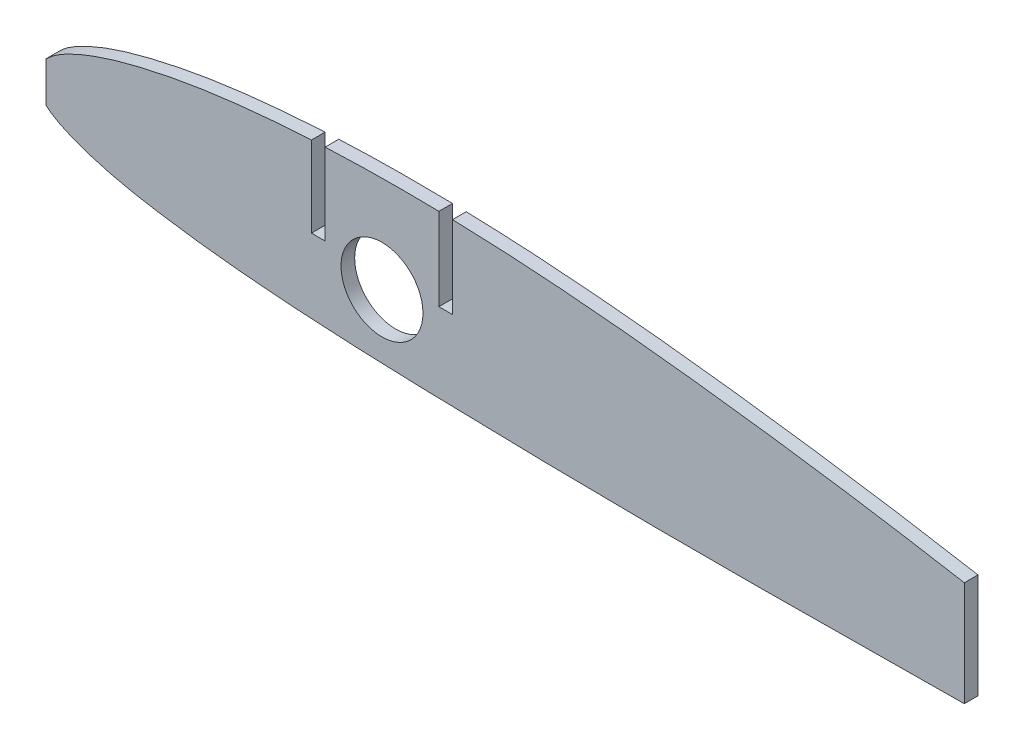
ISO-10303-21;
HEADER;
FILE_DESCRIPTION(('STEP AP214'),'2;1');
FILE_NAME('part.step','',(''),(''),'','','');
FILE_SCHEMA(('AUTOMOTIVE_DESIGN { 1 0 10303 214 1 1 1 1 }'));
ENDSEC;
DATA;
#1=APPLICATION_CONTEXT('core data for automotive mechanical design processes');
#2=APPLICATION_PROTOCOL_DEFINITION('international standard','automotive_design',2000,#1);
#3=PRODUCT_CONTEXT('',#1,'mechanical');
#4=PRODUCT('Part','Part','',(#3));
#5=PRODUCT_RELATED_PRODUCT_CATEGORY('part','',(#4));
#6=PRODUCT_DEFINITION_FORMATION('','',#4);
#7=PRODUCT_DEFINITION_CONTEXT('part definition',#1,'design');
#8=PRODUCT_DEFINITION('design','',#6,#7);
#9=PRODUCT_DEFINITION_SHAPE('','',#8);
#10=(LENGTH_UNIT() NAMED_UNIT(*) SI_UNIT(.MILLI.,.METRE.));
#11=(NAMED_UNIT(*) PLANE_ANGLE_UNIT() SI_UNIT($,.RADIAN.));
#12=(NAMED_UNIT(*) SI_UNIT($,.STERADIAN.) SOLID_ANGLE_UNIT());
#13=UNCERTAINTY_MEASURE_WITH_UNIT(LENGTH_MEASURE(1.E-05),#10,'distance_accuracy_value','');
#14=(GEOMETRIC_REPRESENTATION_CONTEXT(3) GLOBAL_UNCERTAINTY_ASSIGNED_CONTEXT((#13)) GLOBAL_UNIT_ASSIGNED_CONTEXT((#10,
#11,#12)) REPRESENTATION_CONTEXT('',''));
#15=CARTESIAN_POINT('',(0.,0.,0.));
#16=DIRECTION('',(0.,0.,1.));
#17=DIRECTION('',(1.,0.,0.));
#18=AXIS2_PLACEMENT_3D('',#15,#16,#17);
#19=CARTESIAN_POINT('',(276.744987748225,-2.79197214936151,353.5));
#20=CARTESIAN_POINT('',(265.385702299539,-0.102525952060226,353.5));
#21=CARTESIAN_POINT('',(253.985388892226,2.40722052673429,353.5));
#22=CARTESIAN_POINT('',(231.123115134351,7.13717976869783,353.5));
#23=CARTESIAN_POINT('',(219.668942239519,9.35664169025446,353.5));
#24=CARTESIAN_POINT('',(202.450532833243,12.4496078313555,353.5));
#25=CARTESIAN_POINT('',(196.704666185283,13.440005466849,353.5));
#26=CARTESIAN_POINT('',(185.197495983674,15.3228461116195,353.5));
#27=CARTESIAN_POINT('',(179.436018193987,16.2141835090313,353.5));
#28=CARTESIAN_POINT('',(167.896810084417,17.893728145991,353.5));
#29=CARTESIAN_POINT('',(162.119320772121,18.6834646951421,353.5));
#30=CARTESIAN_POINT('',(150.549559093403,20.1691321713492,353.5));
#31=CARTESIAN_POINT('',(144.75767697228,20.8675393934082,353.5));
#32=CARTESIAN_POINT('',(133.154760401473,22.1428230577545,353.5));
#33=CARTESIAN_POINT('',(127.340720116597,22.7192762264088,353.5));
#34=CARTESIAN_POINT('',(115.726117513162,23.709424357867,353.5));
#35=CARTESIAN_POINT('',(109.921864101747,24.1232862944582,353.5));
#36=CARTESIAN_POINT('',(92.520744809096,25.0546950445763,353.5));
#37=CARTESIAN_POINT('',(80.9357651419829,25.2555294240696,353.5));
#38=CARTESIAN_POINT('',(63.5895796794595,24.7232065880675,353.5));
#39=CARTESIAN_POINT('',(57.8126964717804,24.4077796395751,353.5));
#40=CARTESIAN_POINT('',(49.1574110404706,23.6671363341342,353.5));
#41=CARTESIAN_POINT('',(46.2739625797033,23.3763787737244,353.5));
#42=CARTESIAN_POINT('',(40.5111502612539,22.6860279402097,353.5));
#43=CARTESIAN_POINT('',(37.6318485685876,22.2847782579894,353.5));
#44=CARTESIAN_POINT('',(31.8789183292975,21.3311158846026,353.5));
#45=CARTESIAN_POINT('',(29.0054092128865,20.7755209326261,353.5));
#46=CARTESIAN_POINT('',(24.6999044452779,19.8153257223513,353.5));
#47=CARTESIAN_POINT('',(23.2654573893097,19.4760440224903,353.5));
#48=CARTESIAN_POINT('',(20.3984150938273,18.7481383098557,353.5));
#49=CARTESIAN_POINT('',(18.9637408163139,18.3570021632943,353.5));
#50=CARTESIAN_POINT('',(16.1067481624841,17.4970007643702,353.5));
#51=CARTESIAN_POINT('',(14.6927100813507,17.0309960304498,353.5));
#52=CARTESIAN_POINT('',(11.9024860352476,16.0047269328264,353.5));
#53=CARTESIAN_POINT('',(10.5261898907188,15.4447369391054,353.5));
#54=CARTESIAN_POINT('',(8.5001267402739,14.5091751229376,353.5));
#55=CARTESIAN_POINT('',(7.83036180247167,14.1834023037448,353.5));
#56=CARTESIAN_POINT('',(6.5125638980945,13.4777395440471,353.5));
#57=CARTESIAN_POINT('',(5.8652484111271,13.093583044232,353.5));
#58=CARTESIAN_POINT('',(4.63339278490183,12.255605476166,353.5));
#59=CARTESIAN_POINT('',(4.04506664060774,11.801499913743,353.5));
#60=CARTESIAN_POINT('',(3.20911851171096,11.0611287352593,353.5));
#61=CARTESIAN_POINT('',(2.9384315833436,10.8042079578778,353.5));
#62=CARTESIAN_POINT('',(2.41656280801707,10.2655506709287,353.5));
#63=CARTESIAN_POINT('',(2.16520777163042,9.98350791441402,353.5));
#64=CARTESIAN_POINT('',(1.6961027069432,9.39722001277652,353.5));
#65=CARTESIAN_POINT('',(1.47744299371281,9.09171798017102,353.5));
#66=CARTESIAN_POINT('',(1.08543951514707,8.44707856078649,353.5));
#67=CARTESIAN_POINT('',(0.915512906059717,8.1138974038108,353.5));
#68=CARTESIAN_POINT('',(0.714798113541436,7.591559329555,353.5));
#69=CARTESIAN_POINT('',(0.657190765905255,7.41357378269642,353.5));
#70=CARTESIAN_POINT('',(0.566275814158105,7.04748076892279,353.5));
#71=CARTESIAN_POINT('',(0.533643429127128,6.85952694162572,353.5));
#72=CARTESIAN_POINT('',(0.498702002917335,6.48582378560063,353.5));
#73=CARTESIAN_POINT('',(0.495732966569499,6.29850011372436,353.5));
#74=CARTESIAN_POINT('',(0.52230968996706,5.92279426922192,353.5));
#75=CARTESIAN_POINT('',(0.553180601421499,5.73365744403695,353.5));
#76=CARTESIAN_POINT('',(0.641956645984156,5.36725473118463,353.5));
#77=CARTESIAN_POINT('',(0.699629973355688,5.18817461227293,353.5));
#78=CARTESIAN_POINT('',(0.835770495049769,4.83646484464701,353.5));
#79=CARTESIAN_POINT('',(0.914681224373518,4.66311478504048,353.5));
#80=CARTESIAN_POINT('',(1.17380292249289,4.16051764174336,353.5));
#81=CARTESIAN_POINT('',(1.37643115136686,3.84582434066885,353.5));
#82=CARTESIAN_POINT('',(1.82283565835699,3.24449107918009,353.5));
#83=CARTESIAN_POINT('',(2.06824589304086,2.95671921686081,353.5));
#84=CARTESIAN_POINT('',(2.58534964053072,2.41051262223144,353.5));
#85=CARTESIAN_POINT('',(2.85620580773243,2.15293436619,353.5));
#86=CARTESIAN_POINT('',(3.69926945542783,1.41867709401816,353.5));
#87=CARTESIAN_POINT('',(4.30292332269781,0.981675809429943,353.5));
#88=CARTESIAN_POINT('',(5.26264941910545,0.394618320622371,353.5));
#89=CARTESIAN_POINT('',(5.59164837499301,0.21018795952157,353.5));
#90=CARTESIAN_POINT('',(6.25469678184452,-0.135942128867334,353.5));
#91=CARTESIAN_POINT('',(6.5899315213033,-0.298692503036244,353.5));
#92=CARTESIAN_POINT('',(7.60252113336086,-0.767803381874437,353.5));
#93=CARTESIAN_POINT('',(8.2859382103845,-1.0573119714262,353.5));
#94=CARTESIAN_POINT('',(9.66288549070147,-1.60821634971927,353.5));
#95=CARTESIAN_POINT('',(10.3572266890316,-1.86735770780067,353.5));
#96=CARTESIAN_POINT('',(12.4550745137421,-2.60357290101599,353.5));
#97=CARTESIAN_POINT('',(13.8732505211657,-3.03986830856125,353.5));
#98=CARTESIAN_POINT('',(16.7391974161066,-3.83019030322058,353.5));
#99=CARTESIAN_POINT('',(18.1889738248611,-4.18425414277734,353.5));
#100=CARTESIAN_POINT('',(22.5423729703754,-5.14396280214318,353.5));
#101=CARTESIAN_POINT('',(25.4593395833233,-5.65526132904842,353.5));
#102=CARTESIAN_POINT('',(31.3062708137163,-6.56423395168542,353.5));
#103=CARTESIAN_POINT('',(34.2357016185216,-6.96657446813973,353.5));
#104=CARTESIAN_POINT('',(40.1041654270331,-7.68731612494017,353.5));
#105=CARTESIAN_POINT('',(43.0433869770674,-8.00406905310895,353.5));
#106=CARTESIAN_POINT('',(51.8740867408924,-8.84037900937318,353.5));
#107=CARTESIAN_POINT('',(57.7783660734944,-9.24803271848889,353.5));
#108=CARTESIAN_POINT('',(66.6480467800239,-9.74358364190067,353.5));
#109=CARTESIAN_POINT('',(69.6075618701688,-9.88782359391551,353.5));
#110=CARTESIAN_POINT('',(75.5255855472627,-10.1412458429705,353.5));
#111=CARTESIAN_POINT('',(78.4846108166473,-10.250077692201,353.5));
#112=CARTESIAN_POINT('',(84.4026798275555,-10.4431510814279,353.5));
#113=CARTESIAN_POINT('',(87.3617234167665,-10.5275953814749,353.5));
#114=CARTESIAN_POINT('',(93.279819329357,-10.6848569624802,353.5));
#115=CARTESIAN_POINT('',(96.238871495544,-10.7578835000571,353.5));
#116=CARTESIAN_POINT('',(111.034153793677,-11.0944388233902,353.5));
#117=CARTESIAN_POINT('',(122.870449547974,-11.2706104317724,353.5));
#118=CARTESIAN_POINT('',(140.62500502378,-11.3859794315242,353.5));
#119=CARTESIAN_POINT('',(146.543208340051,-11.4002640818137,353.5));
#120=CARTESIAN_POINT('',(158.379650660843,-11.3813247990991,353.5));
#121=CARTESIAN_POINT('',(164.297889135731,-11.3488059215455,353.5));
#122=CARTESIAN_POINT('',(176.134384089483,-11.2598010780386,353.5));
#123=CARTESIAN_POINT('',(182.052639741575,-11.2044157213199,353.5));
#124=CARTESIAN_POINT('',(193.889154400691,-11.0891788869695,353.5));
#125=CARTESIAN_POINT('',(199.807414258045,-11.0281954396602,353.5));
#126=CARTESIAN_POINT('',(217.562198327746,-10.8392577945027,353.5));
#127=CARTESIAN_POINT('',(229.398721047248,-10.7132908878643,353.5));
#128=CARTESIAN_POINT('',(253.071828300073,-10.3790698524525,353.5));
#129=CARTESIAN_POINT('',(264.908412972978,-10.1640212774946,353.5));
#130=CARTESIAN_POINT('',(276.744987748225,-9.97546724161573,353.5));
#131=B_SPLINE_CURVE_WITH_KNOTS('',3,(#19,#20,#21,#22,#23,#24,#25,#26,#27,#28,#29,#30,#31,#32,
#33,#34,#35,#36,#37,#38,#39,#40,#41,#42,#43,#44,#45,#46,#47,#48,#49,#50,#51,#52,#53,#54,#55,#56,
#57,#58,#59,#60,#61,#62,#63,#64,#65,#66,#67,#68,#69,#70,#71,#72,#73,#74,#75,#76,#77,#78,#79,#80,
#81,#82,#83,#84,#85,#86,#87,#88,#89,#90,#91,#92,#93,#94,#95,#96,#97,#98,#99,#100,#101,#102,#103,
#104,#105,#106,#107,#108,#109,#110,#111,#112,#113,#114,#115,#116,#117,#118,#119,#120,#121,#122,
#123,#124,#125,#126,#127,#128,#129,#130),.UNSPECIFIED.,.F.,.F.,(4,2,2,2,2,2,2,2,2,2,2,2,2,2,2,2,
2,2,2,2,2,2,2,2,2,2,2,2,2,2,2,2,2,2,2,2,2,2,2,2,2,2,2,2,2,2,2,2,2,2,2,2,2,2,2,4),(0.,
0.0625000000000003,0.125000000000001,0.156250000000001,0.187500000000001,0.218750000000001,
0.250000000000001,0.281250000000001,0.312500000000001,0.375000000000001,0.406250000000001,
0.421875000000001,0.437500000000001,0.453125000000001,0.460937500000001,0.468750000000001,
0.476562500000001,0.484375000000001,0.488281250000001,0.492187500000001,0.496093750000001,
0.498046875000001,0.500000000000001,0.501953125000001,0.503906250000001,0.504882812500001,
0.505859375000001,0.506835937500001,0.507812500000001,0.508789062500001,0.509765625000001,
0.511718750000001,0.513671875000001,0.515625000000001,0.519531250000001,0.521484375000001,
0.523437500000001,0.527343750000001,0.531250000000001,0.539062500000001,0.546875000000001,
0.562500000000001,0.578125000000001,0.593750000000001,0.625000000000001,0.640625000000001,
0.656250000000001,0.671875000000001,0.687500000000001,0.750000000000001,0.781250000000001,
0.812500000000001,0.843750000000001,0.875000000000001,0.937500000000001,1.),.UNSPECIFIED.);
#132=DIRECTION('',(0.,0.,-1.));
#133=VECTOR('',#132,1.);
#134=SURFACE_OF_LINEAR_EXTRUSION('',#131,#133);
#135=CARTESIAN_POINT('',(61.3107439726029,24.5596377584493,350.5));
#136=CARTESIAN_POINT('',(58.219569717087,24.3913710300533,350.5));
#137=CARTESIAN_POINT('',(55.1300797862992,24.1782248657974,350.5));
#138=CARTESIAN_POINT('',(49.1574110404706,23.6671363341342,350.5));
#139=CARTESIAN_POINT('',(46.2739625797033,23.3763787737244,350.5));
#140=CARTESIAN_POINT('',(40.5111502612539,22.6860279402097,350.5));
#141=CARTESIAN_POINT('',(37.6318485685876,22.2847782579894,350.5));
#142=CARTESIAN_POINT('',(31.8789183292975,21.3311158846026,350.5));
#143=CARTESIAN_POINT('',(29.0054092128865,20.7755209326261,350.5));
#144=CARTESIAN_POINT('',(24.6999044452779,19.8153257223513,350.5));
#145=CARTESIAN_POINT('',(23.2654573893097,19.4760440224903,350.5));
#146=CARTESIAN_POINT('',(20.3984150938273,18.7481383098557,350.5));
#147=CARTESIAN_POINT('',(18.9637408163139,18.3570021632943,350.5));
#148=CARTESIAN_POINT('',(16.1067481624841,17.4970007643702,350.5));
#149=CARTESIAN_POINT('',(14.6927100813507,17.0309960304498,350.5));
#150=CARTESIAN_POINT('',(11.9024860352476,16.0047269328264,350.5));
#151=CARTESIAN_POINT('',(10.5261898907188,15.4447369391054,350.5));
#152=CARTESIAN_POINT('',(8.5001267402739,14.5091751229376,350.5));
#153=CARTESIAN_POINT('',(7.83036180247167,14.1834023037448,350.5));
#154=CARTESIAN_POINT('',(6.5125638980945,13.4777395440471,350.5));
#155=CARTESIAN_POINT('',(5.8652484111271,13.093583044232,350.5));
#156=CARTESIAN_POINT('',(4.63339278490183,12.255605476166,350.5));
#157=CARTESIAN_POINT('',(4.04506664060774,11.801499913743,350.5));
#158=CARTESIAN_POINT('',(3.32225590441982,11.161330723726,350.5));
#159=CARTESIAN_POINT('',(3.15955316405278,11.0111682031635,350.5));
#160=CARTESIAN_POINT('',(3.00003480368661,10.8569542910879,350.5));
#161=B_SPLINE_CURVE_WITH_KNOTS('',3,(#135,#136,#137,#138,#139,#140,#141,#142,#143,#144,#145,
#146,#147,#148,#149,#150,#151,#152,#153,#154,#155,#156,#157,#158,#159,#160),.UNSPECIFIED.,.F.,
.F.,(4,2,2,2,2,2,2,2,2,2,2,2,4),(0.38952842406295,0.406250000000001,0.421875000000001,
0.437500000000001,0.453125000000001,0.460937500000001,0.468750000000001,0.476562500000001,
0.484375000000001,0.488281250000001,0.492187500000001,0.496093750000001,0.497253865975292),.UNSPECIFIED.);
#162=CARTESIAN_POINT('',(61.3107511672693,24.5594393155338,350.5));
#163=VERTEX_POINT('',#162);
#164=CARTESIAN_POINT('',(3.00000000427704,10.8569903087676,350.5));
#165=VERTEX_POINT('',#164);
#166=EDGE_CURVE('E160',#163,#165,#161,.T.);
#167=ORIENTED_EDGE('',*,*,#166,.T.);
#168=DIRECTION('',(0.,0.,-1.));
#169=VECTOR('',#168,1.);
#170=CARTESIAN_POINT('',(2.99999999999999,10.8569206446117,353.5));
#171=LINE('',#170,#169);
#172=CARTESIAN_POINT('',(3.,10.8569991547267,353.5));
#173=VERTEX_POINT('',#172);
#174=EDGE_CURVE('E58',#165,#173,#171,.F.);
#175=ORIENTED_EDGE('',*,*,#174,.T.);
#176=CARTESIAN_POINT('',(3.00003924309868,10.8569585828748,353.5));
#177=CARTESIAN_POINT('',(3.1595561827416,11.0111709891881,353.5));
#178=CARTESIAN_POINT('',(3.32225743982461,11.1613320835824,353.5));
#179=CARTESIAN_POINT('',(4.04506664060774,11.801499913743,353.5));
#180=CARTESIAN_POINT('',(4.63339278490183,12.255605476166,353.5));
#181=CARTESIAN_POINT('',(5.8652484111271,13.093583044232,353.5));
#182=CARTESIAN_POINT('',(6.5125638980945,13.4777395440471,353.5));
#183=CARTESIAN_POINT('',(7.83036180247167,14.1834023037448,353.5));
#184=CARTESIAN_POINT('',(8.5001267402739,14.5091751229376,353.5));
#185=CARTESIAN_POINT('',(10.5261898907188,15.4447369391054,353.5));
#186=CARTESIAN_POINT('',(11.9024860352476,16.0047269328264,353.5));
#187=CARTESIAN_POINT('',(14.6927100813507,17.0309960304498,353.5));
#188=CARTESIAN_POINT('',(16.1067481624841,17.4970007643702,353.5));
#189=CARTESIAN_POINT('',(18.9637408163139,18.3570021632943,353.5));
#190=CARTESIAN_POINT('',(20.3984150938273,18.7481383098557,353.5));
#191=CARTESIAN_POINT('',(23.2654573893097,19.4760440224903,353.5));
#192=CARTESIAN_POINT('',(24.6999044452779,19.8153257223513,353.5));
#193=CARTESIAN_POINT('',(29.0054092128865,20.7755209326261,353.5));
#194=CARTESIAN_POINT('',(31.8789183292975,21.3311158846026,353.5));
#195=CARTESIAN_POINT('',(37.6318485685876,22.2847782579894,353.5));
#196=CARTESIAN_POINT('',(40.5111502612539,22.6860279402097,353.5));
#197=CARTESIAN_POINT('',(46.2739625797033,23.3763787737244,353.5));
#198=CARTESIAN_POINT('',(49.1574110404706,23.6671363341342,353.5));
#199=CARTESIAN_POINT('',(55.1300797935678,24.1782248664194,353.5));
#200=CARTESIAN_POINT('',(58.2195697316331,24.3913710310568,353.5));
#201=CARTESIAN_POINT('',(61.3107439944338,24.5596377596377,353.5));
#202=B_SPLINE_CURVE_WITH_KNOTS('',3,(#176,#177,#178,#179,#180,#181,#182,#183,#184,#185,#186,
#187,#188,#189,#190,#191,#192,#193,#194,#195,#196,#197,#198,#199,#200,#201),.UNSPECIFIED.,.F.,
.F.,(4,2,2,2,2,2,2,2,2,2,2,2,4),(0.389528424023585,0.39068852923683,0.39459477923683,
0.39850102923683,0.40240727923683,0.41021977923683,0.41803227923683,0.42584477923683,
0.43365727923683,0.44928227923683,0.46490727923683,0.48053227923683,0.497253855213246),.UNSPECIFIED.);
#203=CARTESIAN_POINT('',(61.3107511663373,24.559505966989,353.5));
#204=VERTEX_POINT('',#203);
#205=EDGE_CURVE('E145',#204,#173,#202,.F.);
#206=ORIENTED_EDGE('',*,*,#205,.F.);
#207=DIRECTION('',(0.,0.,-1.));
#208=VECTOR('',#207,1.);
#209=CARTESIAN_POINT('',(61.3107511663373,24.559638150037,353.5));
#210=LINE('',#209,#208);
#211=EDGE_CURVE('E171',#204,#163,#210,.T.);
#212=ORIENTED_EDGE('',*,*,#211,.T.);
#213=EDGE_LOOP('',(#167,#175,#206,#212));
#214=FACE_BOUND('',#213,.T.);
#215=ADVANCED_FACE('F39',(#214),#134,.F.);
#216=CARTESIAN_POINT('',(204.744987739681,-10.9756337233499,353.5));
#217=CARTESIAN_POINT('',(199.153622505491,-11.0349220310696,353.5));
#218=CARTESIAN_POINT('',(193.562258660181,-11.0923614480006,353.5));
#219=CARTESIAN_POINT('',(182.052639741575,-11.2044157213199,353.5));
#220=CARTESIAN_POINT('',(176.134384089483,-11.2598010780386,353.5));
#221=CARTESIAN_POINT('',(164.297889135731,-11.3488059215455,353.5));
#222=CARTESIAN_POINT('',(158.379650660843,-11.3813247990991,353.5));
#223=CARTESIAN_POINT('',(146.543208340051,-11.4002640818137,353.5));
#224=CARTESIAN_POINT('',(140.62500502378,-11.3859794315242,353.5));
#225=CARTESIAN_POINT('',(122.870449547974,-11.2706104317724,353.5));
#226=CARTESIAN_POINT('',(111.034153793677,-11.0944388233902,353.5));
#227=CARTESIAN_POINT('',(96.238871495544,-10.7578835000571,353.5));
#228=CARTESIAN_POINT('',(93.279819329357,-10.6848569624802,353.5));
#229=CARTESIAN_POINT('',(87.3617234167665,-10.5275953814749,353.5));
#230=CARTESIAN_POINT('',(84.4026798275555,-10.4431510814279,353.5));
#231=CARTESIAN_POINT('',(78.4846108166473,-10.250077692201,353.5));
#232=CARTESIAN_POINT('',(75.5255855472627,-10.1412458429705,353.5));
#233=CARTESIAN_POINT('',(69.6075618701688,-9.88782359391551,353.5));
#234=CARTESIAN_POINT('',(66.6480467800239,-9.74358364190067,353.5));
#235=CARTESIAN_POINT('',(57.7783660734944,-9.24803271848889,353.5));
#236=CARTESIAN_POINT('',(51.8740867408924,-8.84037900937318,353.5));
#237=CARTESIAN_POINT('',(43.0433869770674,-8.00406905310895,353.5));
#238=CARTESIAN_POINT('',(40.1041654270331,-7.68731612494017,353.5));
#239=CARTESIAN_POINT('',(34.2357016185216,-6.96657446813973,353.5));
#240=CARTESIAN_POINT('',(31.3062708137163,-6.56423395168542,353.5));
#241=CARTESIAN_POINT('',(25.4593395833233,-5.65526132904842,353.5));
#242=CARTESIAN_POINT('',(22.5423729703754,-5.14396280214318,353.5));
#243=CARTESIAN_POINT('',(18.1889738248611,-4.18425414277734,353.5));
#244=CARTESIAN_POINT('',(16.7391974161066,-3.83019030322058,353.5));
#245=CARTESIAN_POINT('',(13.8732505211657,-3.03986830856125,353.5));
#246=CARTESIAN_POINT('',(12.4550745137421,-2.60357290101599,353.5));
#247=CARTESIAN_POINT('',(10.3572266890316,-1.86735770780067,353.5));
#248=CARTESIAN_POINT('',(9.66288549070147,-1.60821634971927,353.5));
#249=CARTESIAN_POINT('',(8.2859382103845,-1.0573119714262,353.5));
#250=CARTESIAN_POINT('',(7.60252113336086,-0.767803381874437,353.5));
#251=CARTESIAN_POINT('',(6.5899315213033,-0.298692503036244,353.5));
#252=CARTESIAN_POINT('',(6.25469678184452,-0.135942128867334,353.5));
#253=CARTESIAN_POINT('',(5.59164837499301,0.21018795952157,353.5));
#254=CARTESIAN_POINT('',(5.26264941910545,0.394618320622371,353.5));
#255=CARTESIAN_POINT('',(4.30292332269781,0.981675809429943,353.5));
#256=CARTESIAN_POINT('',(3.69926945542783,1.41867709401816,353.5));
#257=CARTESIAN_POINT('',(3.09121143579209,1.94825872648496,353.5));
#258=CARTESIAN_POINT('',(3.04546839482108,1.98867939904061,353.5));
#259=CARTESIAN_POINT('',(3.00000729271764,2.02945581023101,353.5));
#260=B_SPLINE_CURVE_WITH_KNOTS('',3,(#216,#217,#218,#219,#220,#221,#222,#223,#224,#225,#226,
#227,#228,#229,#230,#231,#232,#233,#234,#235,#236,#237,#238,#239,#240,#241,#242,#243,#244,#245,
#246,#247,#248,#249,#250,#251,#252,#253,#254,#255,#256,#257,#258,#259),.UNSPECIFIED.,.F.,.F.,(4,
2,2,2,2,2,2,2,2,2,2,2,2,2,2,2,2,2,2,2,2,4),(0.51530518715345,0.544829089195542,
0.576079089195541,0.607329089195541,0.638579089195541,0.701079089195541,0.716704089195541,
0.732329089195541,0.747954089195541,0.763579089195541,0.794829089195541,0.810454089195541,
0.826079089195541,0.841704089195541,0.849516589195541,0.857329089195541,0.861235339195541,
0.865141589195541,0.867094714195541,0.869047839195541,0.872954089195541,0.873273902042092),.UNSPECIFIED.);
#261=CARTESIAN_POINT('',(3.,2.02944768401191,353.5));
#262=VERTEX_POINT('',#261);
#263=CARTESIAN_POINT('',(204.744987748225,-10.9756337232593,353.5));
#264=VERTEX_POINT('',#263);
#265=EDGE_CURVE('E141',#262,#264,#260,.F.);
#266=ORIENTED_EDGE('',*,*,#265,.F.);
#267=DIRECTION('',(0.,0.,-1.));
#268=VECTOR('',#267,1.);
#269=CARTESIAN_POINT('',(2.99999999999996,2.02946235145148,353.5));
#270=LINE('',#269,#268);
#271=CARTESIAN_POINT('',(3.,2.02943946918539,350.5));
#272=VERTEX_POINT('',#271);
#273=EDGE_CURVE('E132',#262,#272,#270,.T.);
#274=ORIENTED_EDGE('',*,*,#273,.T.);
#275=CARTESIAN_POINT('',(3.00001137381415,2.02945214968633,350.5));
#276=CARTESIAN_POINT('',(3.04547113242514,1.98867697996722,350.5));
#277=CARTESIAN_POINT('',(3.09121281274962,1.94825752723852,350.5));
#278=CARTESIAN_POINT('',(3.69926945542783,1.41867709401816,350.5));
#279=CARTESIAN_POINT('',(4.30292332269781,0.981675809429943,350.5));
#280=CARTESIAN_POINT('',(5.26264941910545,0.394618320622371,350.5));
#281=CARTESIAN_POINT('',(5.59164837499301,0.21018795952157,350.5));
#282=CARTESIAN_POINT('',(6.25469678184452,-0.135942128867334,350.5));
#283=CARTESIAN_POINT('',(6.5899315213033,-0.298692503036244,350.5));
#284=CARTESIAN_POINT('',(7.60252113336086,-0.767803381874437,350.5));
#285=CARTESIAN_POINT('',(8.2859382103845,-1.0573119714262,350.5));
#286=CARTESIAN_POINT('',(9.66288549070147,-1.60821634971927,350.5));
#287=CARTESIAN_POINT('',(10.3572266890316,-1.86735770780067,350.5));
#288=CARTESIAN_POINT('',(12.4550745137421,-2.60357290101599,350.5));
#289=CARTESIAN_POINT('',(13.8732505211657,-3.03986830856125,350.5));
#290=CARTESIAN_POINT('',(16.7391974161066,-3.83019030322058,350.5));
#291=CARTESIAN_POINT('',(18.1889738248611,-4.18425414277734,350.5));
#292=CARTESIAN_POINT('',(22.5423729703754,-5.14396280214318,350.5));
#293=CARTESIAN_POINT('',(25.4593395833233,-5.65526132904842,350.5));
#294=CARTESIAN_POINT('',(31.3062708137163,-6.56423395168542,350.5));
#295=CARTESIAN_POINT('',(34.2357016185216,-6.96657446813973,350.5));
#296=CARTESIAN_POINT('',(40.1041654270331,-7.68731612494017,350.5));
#297=CARTESIAN_POINT('',(43.0433869770674,-8.00406905310895,350.5));
#298=CARTESIAN_POINT('',(51.8740867408924,-8.84037900937318,350.5));
#299=CARTESIAN_POINT('',(57.7783660734944,-9.24803271848889,350.5));
#300=CARTESIAN_POINT('',(66.6480467800239,-9.74358364190067,350.5));
#301=CARTESIAN_POINT('',(69.6075618701688,-9.88782359391551,350.5));
#302=CARTESIAN_POINT('',(75.5255855472627,-10.1412458429705,350.5));
#303=CARTESIAN_POINT('',(78.4846108166473,-10.250077692201,350.5));
#304=CARTESIAN_POINT('',(84.4026798275555,-10.4431510814279,350.5));
#305=CARTESIAN_POINT('',(87.3617234167665,-10.5275953814749,350.5));
#306=CARTESIAN_POINT('',(93.279819329357,-10.6848569624802,350.5));
#307=CARTESIAN_POINT('',(96.238871495544,-10.7578835000571,350.5));
#308=CARTESIAN_POINT('',(111.034153793677,-11.0944388233902,350.5));
#309=CARTESIAN_POINT('',(122.870449547974,-11.2706104317724,350.5));
#310=CARTESIAN_POINT('',(140.62500502378,-11.3859794315242,350.5));
#311=CARTESIAN_POINT('',(146.543208340051,-11.4002640818137,350.5));
#312=CARTESIAN_POINT('',(158.379650660843,-11.3813247990991,350.5));
#313=CARTESIAN_POINT('',(164.297889135731,-11.3488059215455,350.5));
#314=CARTESIAN_POINT('',(176.134384089483,-11.2598010780386,350.5));
#315=CARTESIAN_POINT('',(182.052639741575,-11.2044157213199,350.5));
#316=CARTESIAN_POINT('',(193.562258660117,-11.0923614480013,350.5));
#317=CARTESIAN_POINT('',(199.153622505365,-11.0349220310709,350.5));
#318=CARTESIAN_POINT('',(204.744987739491,-10.9756337233519,350.5));
#319=B_SPLINE_CURVE_WITH_KNOTS('',3,(#275,#276,#277,#278,#279,#280,#281,#282,#283,#284,#285,
#286,#287,#288,#289,#290,#291,#292,#293,#294,#295,#296,#297,#298,#299,#300,#301,#302,#303,#304,
#305,#306,#307,#308,#309,#310,#311,#312,#313,#314,#315,#316,#317,#318),.UNSPECIFIED.,.F.,.F.,(4,
2,2,2,2,2,2,2,2,2,2,2,2,2,2,2,2,2,2,2,2,4),(0.51530519672344,0.515625000000001,
0.519531250000001,0.521484375000001,0.523437500000001,0.527343750000001,0.531250000000001,
0.539062500000001,0.546875000000001,0.562500000000001,0.578125000000001,0.593750000000001,
0.625000000000001,0.640625000000001,0.656250000000001,0.671875000000001,0.687500000000001,
0.750000000000001,0.781250000000001,0.812500000000001,0.843750000000001,0.873273902041758),.UNSPECIFIED.);
#320=CARTESIAN_POINT('',(204.744987743859,-10.9756341351762,350.5));
#321=VERTEX_POINT('',#320);
#322=EDGE_CURVE('E66',#272,#321,#319,.T.);
#323=ORIENTED_EDGE('',*,*,#322,.T.);
#324=DIRECTION('',(0.,0.,-1.));
#325=VECTOR('',#324,1.);
#326=CARTESIAN_POINT('',(204.744987748225,-10.9756337232593,353.5));
#327=LINE('',#326,#325);
#328=EDGE_CURVE('E149',#321,#264,#327,.F.);
#329=ORIENTED_EDGE('',*,*,#328,.T.);
#330=EDGE_LOOP('',(#266,#274,#323,#329));
#331=FACE_BOUND('',#330,.T.);
#332=ADVANCED_FACE('F148',(#331),#134,.F.);
#333=CARTESIAN_POINT('',(89.3107514818336,24.9879911083188,350.5));
#334=CARTESIAN_POINT('',(82.658148033048,25.1249692236568,350.5));
#335=CARTESIAN_POINT('',(76.0114569072778,25.1044113739075,350.5));
#336=CARTESIAN_POINT('',(67.6842217261764,24.848863694146,350.5));
#337=CARTESIAN_POINT('',(65.9972430086036,24.7853277450495,350.5));
#338=CARTESIAN_POINT('',(64.3107429863273,24.7090367882676,350.5));
#339=B_SPLINE_CURVE_WITH_KNOTS('',3,(#333,#334,#335,#336,#337,#338),.UNSPECIFIED.,.F.,.F.,(4,2,
4),(0.339114145109945,0.375000000000001,0.384119907322907),.UNSPECIFIED.);
#340=CARTESIAN_POINT('',(89.3107511663373,24.9879757856375,350.5));
#341=VERTEX_POINT('',#340);
#342=CARTESIAN_POINT('',(64.3107491232491,24.7089011669015,350.5));
#343=VERTEX_POINT('',#342);
#344=EDGE_CURVE('E152',#341,#343,#339,.T.);
#345=ORIENTED_EDGE('',*,*,#344,.T.);
#346=DIRECTION('',(0.,0.,-1.));
#347=VECTOR('',#346,1.);
#348=CARTESIAN_POINT('',(64.3107511663373,24.7090371583005,353.5));
#349=LINE('',#348,#347);
#350=CARTESIAN_POINT('',(64.3107511663373,24.7089487769464,353.5));
#351=VERTEX_POINT('',#350);
#352=EDGE_CURVE('E172',#343,#351,#349,.F.);
#353=ORIENTED_EDGE('',*,*,#352,.T.);
#354=CARTESIAN_POINT('',(64.310743190274,24.7090367974934,353.5));
#355=CARTESIAN_POINT('',(65.9972431446067,24.7853277501718,353.5));
#356=CARTESIAN_POINT('',(67.6842217941957,24.8488636962334,353.5));
#357=CARTESIAN_POINT('',(76.0114569335193,25.1044113747128,353.5));
#358=CARTESIAN_POINT('',(82.6581480855853,25.1249692238193,353.5));
#359=CARTESIAN_POINT('',(89.3107515607097,24.9879911066948,353.5));
#360=B_SPLINE_CURVE_WITH_KNOTS('',3,(#354,#355,#356,#357,#358,#359),.UNSPECIFIED.,.F.,.F.,(4,2,
4),(0.339114144968119,0.348234051923404,0.384119906955286),.UNSPECIFIED.);
#361=CARTESIAN_POINT('',(89.3107511663373,24.9879815314087,353.5));
#362=VERTEX_POINT('',#361);
#363=EDGE_CURVE('E151',#362,#351,#360,.F.);
#364=ORIENTED_EDGE('',*,*,#363,.F.);
#365=DIRECTION('',(0.,0.,-1.));
#366=VECTOR('',#365,1.);
#367=CARTESIAN_POINT('',(89.3107511663373,24.9879911148149,353.5));
#368=LINE('',#367,#366);
#369=EDGE_CURVE('E174',#362,#341,#368,.T.);
#370=ORIENTED_EDGE('',*,*,#369,.T.);
#371=EDGE_LOOP('',(#345,#353,#364,#370));
#372=FACE_BOUND('',#371,.T.);
#373=ADVANCED_FACE('F336',(#372),#134,.F.);
#374=CARTESIAN_POINT('',(92.3107526118352,24.9156401019849,353.5));
#375=CARTESIAN_POINT('',(96.2457150327239,24.8069805096493,353.5));
#376=CARTESIAN_POINT('',(100.182694233008,24.6445831077305,353.5));
#377=CARTESIAN_POINT('',(109.921864101747,24.1232862944582,353.5));
#378=CARTESIAN_POINT('',(115.726117513162,23.709424357867,353.5));
#379=CARTESIAN_POINT('',(127.340720116597,22.7192762264088,353.5));
#380=CARTESIAN_POINT('',(133.154760401473,22.1428230577545,353.5));
#381=CARTESIAN_POINT('',(144.75767697228,20.8675393934082,353.5));
#382=CARTESIAN_POINT('',(150.549559093403,20.1691321713492,353.5));
#383=CARTESIAN_POINT('',(162.119320772121,18.6834646951421,353.5));
#384=CARTESIAN_POINT('',(167.896810084417,17.893728145991,353.5));
#385=CARTESIAN_POINT('',(179.436018193987,16.2141835090313,353.5));
#386=CARTESIAN_POINT('',(185.197495983674,15.3228461116195,353.5));
#387=CARTESIAN_POINT('',(195.553768893555,13.6283190279465,353.5));
#388=CARTESIAN_POINT('',(200.151517279741,12.8438692415162,353.5));
#389=CARTESIAN_POINT('',(204.745002826304,12.0323696777374,353.5));
#390=B_SPLINE_CURVE_WITH_KNOTS('',3,(#374,#375,#376,#377,#378,#379,#380,#381,#382,#383,#384,
#385,#386,#387,#388,#389),.UNSPECIFIED.,.F.,.F.,(4,2,2,2,2,2,2,4),(0.131250979126293,
0.152471579427269,0.183721579427269,0.214971579427269,0.246221579427269,0.277471579427269,
0.30872157942727,0.333720600300977),.UNSPECIFIED.);
#391=CARTESIAN_POINT('',(204.74500144935,12.0323618835025,353.5));
#392=VERTEX_POINT('',#391);
#393=CARTESIAN_POINT('',(92.3107511663373,24.9156139565463,353.5));
#394=VERTEX_POINT('',#393);
#395=EDGE_CURVE('E241',#392,#394,#390,.F.);
#396=ORIENTED_EDGE('',*,*,#395,.F.);
#397=DIRECTION('',(0.,0.,-1.));
#398=VECTOR('',#397,1.);
#399=CARTESIAN_POINT('',(204.744987748225,12.032372341478,350.5));
#400=LINE('',#399,#398);
#401=CARTESIAN_POINT('',(204.744987748225,12.0323618833309,350.5));
#402=VERTEX_POINT('',#401);
#403=EDGE_CURVE('E267',#402,#392,#400,.F.);
#404=ORIENTED_EDGE('',*,*,#403,.F.);
#405=CARTESIAN_POINT('',(204.744998903745,12.032370370709,350.5));
#406=CARTESIAN_POINT('',(200.151514662274,12.843869688098,350.5));
#407=CARTESIAN_POINT('',(195.553767583416,13.6283192423157,350.5));
#408=CARTESIAN_POINT('',(185.197495983674,15.3228461116195,350.5));
#409=CARTESIAN_POINT('',(179.436018193987,16.2141835090313,350.5));
#410=CARTESIAN_POINT('',(167.896810084417,17.893728145991,350.5));
#411=CARTESIAN_POINT('',(162.119320772121,18.6834646951421,350.5));
#412=CARTESIAN_POINT('',(150.549559093403,20.1691321713492,350.5));
#413=CARTESIAN_POINT('',(144.75767697228,20.8675393934082,350.5));
#414=CARTESIAN_POINT('',(133.154760401473,22.1428230577545,350.5));
#415=CARTESIAN_POINT('',(127.340720116597,22.7192762264088,350.5));
#416=CARTESIAN_POINT('',(115.726117513162,23.709424357867,350.5));
#417=CARTESIAN_POINT('',(109.921864101747,24.1232862944582,350.5));
#418=CARTESIAN_POINT('',(100.182694201839,24.6445831093989,350.5));
#419=CARTESIAN_POINT('',(96.2457149704148,24.8069805122195,350.5));
#420=CARTESIAN_POINT('',(92.3107525184196,24.9156401045645,350.5));
#421=B_SPLINE_CURVE_WITH_KNOTS('',3,(#405,#406,#407,#408,#409,#410,#411,#412,#413,#414,#415,
#416,#417,#418,#419,#420),.UNSPECIFIED.,.F.,.F.,(4,2,2,2,2,2,2,4),(0.131250986242178,
0.156250000000001,0.187500000000001,0.218750000000001,0.250000000000001,0.281250000000001,
0.312500000000001,0.333720600468902),.UNSPECIFIED.);
#422=CARTESIAN_POINT('',(92.3107515042387,24.9156033816741,350.5));
#423=VERTEX_POINT('',#422);
#424=EDGE_CURVE('E150',#402,#423,#421,.T.);
#425=ORIENTED_EDGE('',*,*,#424,.T.);
#426=DIRECTION('',(0.,0.,-1.));
#427=VECTOR('',#426,1.);
#428=CARTESIAN_POINT('',(92.3107511663372,24.9156401419007,353.5));
#429=LINE('',#428,#427);
#430=EDGE_CURVE('E236',#423,#394,#429,.F.);
#431=ORIENTED_EDGE('',*,*,#430,.T.);
#432=EDGE_LOOP('',(#396,#404,#425,#431));
#433=FACE_BOUND('',#432,.T.);
#434=ADVANCED_FACE('F41',(#433),#134,.F.);
#435=CARTESIAN_POINT('',(1.93065523928717,9.69036396359572,353.5));
#436=DIRECTION('',(0.,0.,-1.));
#437=DIRECTION('',(-1.,0.,0.));
#438=AXIS2_PLACEMENT_3D('',#435,#436,#437);
#439=PLANE('',#438);
#440=CARTESIAN_POINT('',(76.8107511663373,3.84084563896709,353.5));
#441=DIRECTION('',(0.,0.,1.));
#442=DIRECTION('',(1.,0.,0.));
#443=AXIS2_PLACEMENT_3D('',#440,#441,#442);
#444=CIRCLE('',#443,9.);
#445=CARTESIAN_POINT('',(85.8107511663373,3.84084563896709,353.5));
#446=VERTEX_POINT('',#445);
#447=EDGE_CURVE('E280',#446,#446,#444,.T.);
#448=ORIENTED_EDGE('',*,*,#447,.F.);
#449=EDGE_LOOP('',(#448));
#450=FACE_BOUND('',#449,.T.);
#451=ORIENTED_EDGE('',*,*,#205,.T.);
#452=DIRECTION('',(0.,1.,0.));
#453=VECTOR('',#452,1.);
#454=CARTESIAN_POINT('',(3.,0.,353.5));
#455=LINE('',#454,#453);
#456=EDGE_CURVE('E135',#262,#173,#455,.T.);
#457=ORIENTED_EDGE('',*,*,#456,.F.);
#458=ORIENTED_EDGE('',*,*,#265,.T.);
#459=DIRECTION('',(0.,1.,0.));
#460=VECTOR('',#459,1.);
#461=CARTESIAN_POINT('',(204.744987748225,9.69036396359557,353.5));
#462=LINE('',#461,#460);
#463=EDGE_CURVE('E276',#264,#392,#462,.T.);
#464=ORIENTED_EDGE('',*,*,#463,.T.);
#465=ORIENTED_EDGE('',*,*,#395,.T.);
#466=DIRECTION('',(0.,1.,0.));
#467=VECTOR('',#466,1.);
#468=CARTESIAN_POINT('',(92.3107511663373,6.84084563896709,353.5));
#469=LINE('',#468,#467);
#470=CARTESIAN_POINT('',(92.3107511663373,6.84084563896709,353.5));
#471=VERTEX_POINT('',#470);
#472=EDGE_CURVE('E311',#471,#394,#469,.T.);
#473=ORIENTED_EDGE('',*,*,#472,.F.);
#474=DIRECTION('',(1.,0.,0.));
#475=VECTOR('',#474,1.);
#476=CARTESIAN_POINT('',(89.3107511663373,6.84084563896709,353.5));
#477=LINE('',#476,#475);
#478=CARTESIAN_POINT('',(89.3107511663373,6.84084563896709,353.5));
#479=VERTEX_POINT('',#478);
#480=EDGE_CURVE('E301',#479,#471,#477,.T.);
#481=ORIENTED_EDGE('',*,*,#480,.F.);
#482=DIRECTION('',(0.,-1.,0.));
#483=VECTOR('',#482,1.);
#484=CARTESIAN_POINT('',(89.3107511663373,6.84084563896709,353.5));
#485=LINE('',#484,#483);
#486=EDGE_CURVE('E298',#362,#479,#485,.T.);
#487=ORIENTED_EDGE('',*,*,#486,.F.);
#488=ORIENTED_EDGE('',*,*,#363,.T.);
#489=DIRECTION('',(0.,1.,0.));
#490=VECTOR('',#489,1.);
#491=CARTESIAN_POINT('',(64.3107511663373,6.84084563896709,353.5));
#492=LINE('',#491,#490);
#493=CARTESIAN_POINT('',(64.3107511663373,6.84084563896709,353.5));
#494=VERTEX_POINT('',#493);
#495=EDGE_CURVE('E287',#494,#351,#492,.T.);
#496=ORIENTED_EDGE('',*,*,#495,.F.);
#497=DIRECTION('',(1.,0.,0.));
#498=VECTOR('',#497,1.);
#499=CARTESIAN_POINT('',(61.3107511663373,6.84084563896709,353.5));
#500=LINE('',#499,#498);
#501=CARTESIAN_POINT('',(61.3107511663373,6.84084563896709,353.5));
#502=VERTEX_POINT('',#501);
#503=EDGE_CURVE('E284',#502,#494,#500,.T.);
#504=ORIENTED_EDGE('',*,*,#503,.F.);
#505=DIRECTION('',(0.,-1.,0.));
#506=VECTOR('',#505,1.);
#507=CARTESIAN_POINT('',(61.3107511663373,6.84084563896709,353.5));
#508=LINE('',#507,#506);
#509=EDGE_CURVE('E178',#204,#502,#508,.T.);
#510=ORIENTED_EDGE('',*,*,#509,.F.);
#511=EDGE_LOOP('',(#451,#457,#458,#464,#465,#473,#481,#487,#488,#496,#504,#510));
#512=FACE_BOUND('',#511,.T.);
#513=ADVANCED_FACE('F139',(#450,#512),#439,.F.);
#514=CARTESIAN_POINT('',(1.93065523928717,9.69036396359572,350.5));
#515=DIRECTION('',(0.,0.,-1.));
#516=DIRECTION('',(-1.,0.,0.));
#517=AXIS2_PLACEMENT_3D('',#514,#515,#516);
#518=PLANE('',#517);
#519=DIRECTION('',(0.,-1.,0.));
#520=VECTOR('',#519,1.);
#521=CARTESIAN_POINT('',(3.,9.69036396359572,350.5));
#522=LINE('',#521,#520);
#523=EDGE_CURVE('E11',#165,#272,#522,.T.);
#524=ORIENTED_EDGE('',*,*,#523,.F.);
#525=ORIENTED_EDGE('',*,*,#166,.F.);
#526=DIRECTION('',(0.,1.,0.));
#527=VECTOR('',#526,1.);
#528=CARTESIAN_POINT('',(61.3107511663373,9.69036396359572,350.5));
#529=LINE('',#528,#527);
#530=CARTESIAN_POINT('',(61.3107511663373,6.84084563896709,350.5));
#531=VERTEX_POINT('',#530);
#532=EDGE_CURVE('E255',#531,#163,#529,.T.);
#533=ORIENTED_EDGE('',*,*,#532,.F.);
#534=DIRECTION('',(-1.,0.,0.));
#535=VECTOR('',#534,1.);
#536=CARTESIAN_POINT('',(1.93065523928717,6.84084563896709,350.5));
#537=LINE('',#536,#535);
#538=CARTESIAN_POINT('',(64.3107511663373,6.84084563896709,350.5));
#539=VERTEX_POINT('',#538);
#540=EDGE_CURVE('E248',#539,#531,#537,.T.);
#541=ORIENTED_EDGE('',*,*,#540,.F.);
#542=DIRECTION('',(0.,-1.,0.));
#543=VECTOR('',#542,1.);
#544=CARTESIAN_POINT('',(64.3107511663373,9.69036396359572,350.5));
#545=LINE('',#544,#543);
#546=EDGE_CURVE('E252',#343,#539,#545,.T.);
#547=ORIENTED_EDGE('',*,*,#546,.F.);
#548=ORIENTED_EDGE('',*,*,#344,.F.);
#549=DIRECTION('',(0.,1.,0.));
#550=VECTOR('',#549,1.);
#551=CARTESIAN_POINT('',(89.3107511663373,9.69036396359572,350.5));
#552=LINE('',#551,#550);
#553=CARTESIAN_POINT('',(89.3107511663373,6.84084563896709,350.5));
#554=VERTEX_POINT('',#553);
#555=EDGE_CURVE('E244',#554,#341,#552,.T.);
#556=ORIENTED_EDGE('',*,*,#555,.F.);
#557=DIRECTION('',(-1.,0.,0.));
#558=VECTOR('',#557,1.);
#559=CARTESIAN_POINT('',(1.93065523928717,6.84084563896709,350.5));
#560=LINE('',#559,#558);
#561=CARTESIAN_POINT('',(92.3107511663373,6.84084563896709,350.5));
#562=VERTEX_POINT('',#561);
#563=EDGE_CURVE('E238',#562,#554,#560,.T.);
#564=ORIENTED_EDGE('',*,*,#563,.F.);
#565=DIRECTION('',(0.,-1.,0.));
#566=VECTOR('',#565,1.);
#567=CARTESIAN_POINT('',(92.3107511663373,9.69036396359572,350.5));
#568=LINE('',#567,#566);
#569=EDGE_CURVE('E240',#423,#562,#568,.T.);
#570=ORIENTED_EDGE('',*,*,#569,.F.);
#571=ORIENTED_EDGE('',*,*,#424,.F.);
#572=DIRECTION('',(0.,1.,0.));
#573=VECTOR('',#572,1.);
#574=CARTESIAN_POINT('',(204.744987748225,9.69036396359557,350.5));
#575=LINE('',#574,#573);
#576=EDGE_CURVE('E51',#321,#402,#575,.T.);
#577=ORIENTED_EDGE('',*,*,#576,.F.);
#578=ORIENTED_EDGE('',*,*,#322,.F.);
#579=EDGE_LOOP('',(#524,#525,#533,#541,#547,#548,#556,#564,#570,#571,#577,#578));
#580=FACE_BOUND('',#579,.T.);
#581=CARTESIAN_POINT('',(76.8107511663373,3.84084563896709,350.5));
#582=DIRECTION('',(0.,0.,-1.));
#583=DIRECTION('',(-1.,0.,0.));
#584=AXIS2_PLACEMENT_3D('',#581,#582,#583);
#585=CIRCLE('',#584,9.);
#586=CARTESIAN_POINT('',(67.8107511663373,3.84084563896709,350.5));
#587=VERTEX_POINT('',#586);
#588=EDGE_CURVE('E233',#587,#587,#585,.T.);
#589=ORIENTED_EDGE('',*,*,#588,.F.);
#590=EDGE_LOOP('',(#589));
#591=FACE_BOUND('',#590,.T.);
#592=ADVANCED_FACE('F206',(#580,#591),#518,.T.);
#593=CARTESIAN_POINT('',(76.8107511663373,3.84084563896709,340.57701249174));
#594=DIRECTION('',(0.,0.,1.));
#595=DIRECTION('',(1.,0.,0.));
#596=AXIS2_PLACEMENT_3D('',#593,#594,#595);
#597=CYLINDRICAL_SURFACE('',#596,9.);
#598=ORIENTED_EDGE('',*,*,#588,.T.);
#599=EDGE_LOOP('',(#598));
#600=FACE_BOUND('',#599,.T.);
#601=ORIENTED_EDGE('',*,*,#447,.T.);
#602=EDGE_LOOP('',(#601));
#603=FACE_BOUND('',#602,.T.);
#604=ADVANCED_FACE('F208',(#600,#603),#597,.F.);
#605=CARTESIAN_POINT('',(89.3107511663373,6.84084563896709,340.57701249174));
#606=DIRECTION('',(-1.,0.,0.));
#607=DIRECTION('',(0.,0.,1.));
#608=AXIS2_PLACEMENT_3D('',#605,#606,#607);
#609=PLANE('',#608);
#610=ORIENTED_EDGE('',*,*,#486,.T.);
#611=DIRECTION('',(0.,0.,1.));
#612=VECTOR('',#611,1.);
#613=CARTESIAN_POINT('',(89.3107511663373,6.84084563896709,340.57701249174));
#614=LINE('',#613,#612);
#615=EDGE_CURVE('E313',#554,#479,#614,.T.);
#616=ORIENTED_EDGE('',*,*,#615,.F.);
#617=ORIENTED_EDGE('',*,*,#555,.T.);
#618=ORIENTED_EDGE('',*,*,#369,.F.);
#619=EDGE_LOOP('',(#610,#616,#617,#618));
#620=FACE_BOUND('',#619,.T.);
#621=ADVANCED_FACE('F335',(#620),#609,.F.);
#622=CARTESIAN_POINT('',(92.3107511663373,6.84084563896709,340.57701249174));
#623=DIRECTION('',(1.,0.,0.));
#624=DIRECTION('',(0.,0.,-1.));
#625=AXIS2_PLACEMENT_3D('',#622,#623,#624);
#626=PLANE('',#625);
#627=ORIENTED_EDGE('',*,*,#569,.T.);
#628=DIRECTION('',(0.,0.,1.));
#629=VECTOR('',#628,1.);
#630=CARTESIAN_POINT('',(92.3107511663373,6.84084563896709,340.57701249174));
#631=LINE('',#630,#629);
#632=EDGE_CURVE('E310',#562,#471,#631,.T.);
#633=ORIENTED_EDGE('',*,*,#632,.T.);
#634=ORIENTED_EDGE('',*,*,#472,.T.);
#635=ORIENTED_EDGE('',*,*,#430,.F.);
#636=EDGE_LOOP('',(#627,#633,#634,#635));
#637=FACE_BOUND('',#636,.T.);
#638=ADVANCED_FACE('F414',(#637),#626,.F.);
#639=CARTESIAN_POINT('',(89.3107511663373,6.84084563896709,340.57701249174));
#640=DIRECTION('',(0.,-1.,0.));
#641=DIRECTION('',(0.,0.,-1.));
#642=AXIS2_PLACEMENT_3D('',#639,#640,#641);
#643=PLANE('',#642);
#644=ORIENTED_EDGE('',*,*,#563,.T.);
#645=ORIENTED_EDGE('',*,*,#615,.T.);
#646=ORIENTED_EDGE('',*,*,#480,.T.);
#647=ORIENTED_EDGE('',*,*,#632,.F.);
#648=EDGE_LOOP('',(#644,#645,#646,#647));
#649=FACE_BOUND('',#648,.T.);
#650=ADVANCED_FACE('F407',(#649),#643,.F.);
#651=CARTESIAN_POINT('',(61.3107511663373,6.84084563896709,340.57701249174));
#652=DIRECTION('',(-1.,0.,0.));
#653=DIRECTION('',(0.,0.,1.));
#654=AXIS2_PLACEMENT_3D('',#651,#652,#653);
#655=PLANE('',#654);
#656=ORIENTED_EDGE('',*,*,#509,.T.);
#657=DIRECTION('',(0.,0.,1.));
#658=VECTOR('',#657,1.);
#659=CARTESIAN_POINT('',(61.3107511663373,6.84084563896709,340.57701249174));
#660=LINE('',#659,#658);
#661=EDGE_CURVE('E293',#531,#502,#660,.T.);
#662=ORIENTED_EDGE('',*,*,#661,.F.);
#663=ORIENTED_EDGE('',*,*,#532,.T.);
#664=ORIENTED_EDGE('',*,*,#211,.F.);
#665=EDGE_LOOP('',(#656,#662,#663,#664));
#666=FACE_BOUND('',#665,.T.);
#667=ADVANCED_FACE('F328',(#666),#655,.F.);
#668=CARTESIAN_POINT('',(64.3107511663373,6.84084563896709,340.57701249174));
#669=DIRECTION('',(1.,0.,0.));
#670=DIRECTION('',(0.,0.,-1.));
#671=AXIS2_PLACEMENT_3D('',#668,#669,#670);
#672=PLANE('',#671);
#673=ORIENTED_EDGE('',*,*,#546,.T.);
#674=DIRECTION('',(0.,0.,1.));
#675=VECTOR('',#674,1.);
#676=CARTESIAN_POINT('',(64.3107511663373,6.84084563896709,340.57701249174));
#677=LINE('',#676,#675);
#678=EDGE_CURVE('E237',#539,#494,#677,.T.);
#679=ORIENTED_EDGE('',*,*,#678,.T.);
#680=ORIENTED_EDGE('',*,*,#495,.T.);
#681=ORIENTED_EDGE('',*,*,#352,.F.);
#682=EDGE_LOOP('',(#673,#679,#680,#681));
#683=FACE_BOUND('',#682,.T.);
#684=ADVANCED_FACE('F323',(#683),#672,.F.);
#685=CARTESIAN_POINT('',(61.3107511663373,6.84084563896709,340.57701249174));
#686=DIRECTION('',(0.,-1.,0.));
#687=DIRECTION('',(0.,0.,-1.));
#688=AXIS2_PLACEMENT_3D('',#685,#686,#687);
#689=PLANE('',#688);
#690=ORIENTED_EDGE('',*,*,#540,.T.);
#691=ORIENTED_EDGE('',*,*,#661,.T.);
#692=ORIENTED_EDGE('',*,*,#503,.T.);
#693=ORIENTED_EDGE('',*,*,#678,.F.);
#694=EDGE_LOOP('',(#690,#691,#692,#693));
#695=FACE_BOUND('',#694,.T.);
#696=ADVANCED_FACE('F326',(#695),#689,.F.);
#697=CARTESIAN_POINT('',(204.744987748225,-24.7998012743081,350.488970778662));
#698=DIRECTION('',(-1.,0.,0.));
#699=DIRECTION('',(0.,-1.,0.));
#700=AXIS2_PLACEMENT_3D('',#697,#698,#699);
#701=PLANE('',#700);
#702=ORIENTED_EDGE('',*,*,#328,.F.);
#703=ORIENTED_EDGE('',*,*,#576,.T.);
#704=ORIENTED_EDGE('',*,*,#403,.T.);
#705=ORIENTED_EDGE('',*,*,#463,.F.);
#706=EDGE_LOOP('',(#702,#703,#704,#705));
#707=FACE_BOUND('',#706,.T.);
#708=ADVANCED_FACE('F377',(#707),#701,.F.);
#709=CARTESIAN_POINT('',(3.,0.,350.5));
#710=DIRECTION('',(1.,0.,0.));
#711=DIRECTION('',(0.,0.,-1.));
#712=AXIS2_PLACEMENT_3D('',#709,#710,#711);
#713=PLANE('',#712);
#714=ORIENTED_EDGE('',*,*,#523,.T.);
#715=ORIENTED_EDGE('',*,*,#273,.F.);
#716=ORIENTED_EDGE('',*,*,#456,.T.);
#717=ORIENTED_EDGE('',*,*,#174,.F.);
#718=EDGE_LOOP('',(#714,#715,#716,#717));
#719=FACE_BOUND('',#718,.T.);
#720=ADVANCED_FACE('F134',(#719),#713,.F.);
#721=CLOSED_SHELL('',(#215,#332,#373,#434,#513,#592,#604,#621,#638,#650,#667,#684,#696,#708,#720));
#722=MANIFOLD_SOLID_BREP('B2',#721);
#723=ADVANCED_BREP_SHAPE_REPRESENTATION('',(#18,#722),#14);
#724=SHAPE_DEFINITION_REPRESENTATION(#9,#723);
ENDSEC;
END-ISO-10303-21;
